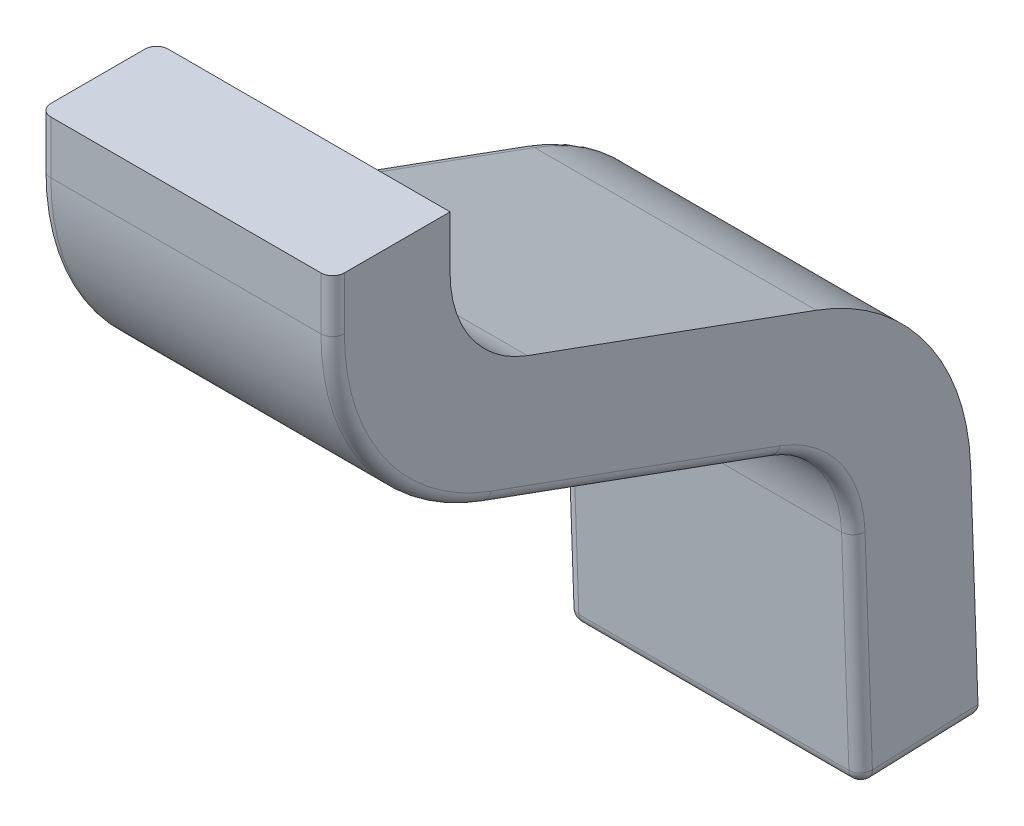
ISO-10303-21;
HEADER;
FILE_DESCRIPTION(('STEP AP214'),'2;1');
FILE_NAME('part.step','',(''),(''),'','','');
FILE_SCHEMA(('AUTOMOTIVE_DESIGN { 1 0 10303 214 1 1 1 1 }'));
ENDSEC;
DATA;
#1=APPLICATION_CONTEXT('core data for automotive mechanical design processes');
#2=APPLICATION_PROTOCOL_DEFINITION('international standard','automotive_design',2000,#1);
#3=PRODUCT_CONTEXT('',#1,'mechanical');
#4=PRODUCT('Part','Part','',(#3));
#5=PRODUCT_RELATED_PRODUCT_CATEGORY('part','',(#4));
#6=PRODUCT_DEFINITION_FORMATION('','',#4);
#7=PRODUCT_DEFINITION_CONTEXT('part definition',#1,'design');
#8=PRODUCT_DEFINITION('design','',#6,#7);
#9=PRODUCT_DEFINITION_SHAPE('','',#8);
#10=(LENGTH_UNIT() NAMED_UNIT(*) SI_UNIT(.MILLI.,.METRE.));
#11=(NAMED_UNIT(*) PLANE_ANGLE_UNIT() SI_UNIT($,.RADIAN.));
#12=(NAMED_UNIT(*) SI_UNIT($,.STERADIAN.) SOLID_ANGLE_UNIT());
#13=UNCERTAINTY_MEASURE_WITH_UNIT(LENGTH_MEASURE(1.E-05),#10,'distance_accuracy_value','');
#14=(GEOMETRIC_REPRESENTATION_CONTEXT(3) GLOBAL_UNCERTAINTY_ASSIGNED_CONTEXT((#13)) GLOBAL_UNIT_ASSIGNED_CONTEXT((#10,
#11,#12)) REPRESENTATION_CONTEXT('',''));
#15=CARTESIAN_POINT('',(0.,0.,0.));
#16=DIRECTION('',(0.,0.,1.));
#17=DIRECTION('',(1.,0.,0.));
#18=AXIS2_PLACEMENT_3D('',#15,#16,#17);
#19=CARTESIAN_POINT('',(-0.23,-1.182804143196,-0.819350743904));
#20=DIRECTION('',(1.,0.,0.));
#21=DIRECTION('',(0.,0.,-1.));
#22=AXIS2_PLACEMENT_3D('',#19,#20,#21);
#23=SPHERICAL_SURFACE('',#22,0.02);
#24=CARTESIAN_POINT('',(-0.23,-1.18280414319596,-0.819350743903962));
#25=DIRECTION('',(0.,0.0348994967024934,-0.999390827019096));
#26=DIRECTION('',(0.,0.999390827019096,0.0348994967024934));
#27=AXIS2_PLACEMENT_3D('',#24,#25,#26);
#28=CIRCLE('',#27,0.02);
#29=CARTESIAN_POINT('',(-0.23,-1.20279805146613,-0.819699738871005));
#30=VERTEX_POINT('',#29);
#31=CARTESIAN_POINT('',(-0.25,-1.182804143196,-0.819350743904126));
#32=VERTEX_POINT('',#31);
#33=EDGE_CURVE('E717',#30,#32,#28,.T.);
#34=ORIENTED_EDGE('',*,*,#33,.F.);
#35=CARTESIAN_POINT('',(-0.23,-1.182804143196,-0.819350743904));
#36=DIRECTION('',(-1.,0.,0.));
#37=DIRECTION('',(0.,0.,1.));
#38=AXIS2_PLACEMENT_3D('',#35,#36,#37);
#39=CIRCLE('',#38,0.02);
#40=CARTESIAN_POINT('',(-0.23,-1.18350213313,-0.799362927364213));
#41=VERTEX_POINT('',#40);
#42=EDGE_CURVE('E802',#41,#30,#39,.F.);
#43=ORIENTED_EDGE('',*,*,#42,.F.);
#44=CARTESIAN_POINT('',(-0.23,-1.18280414319598,-0.819350743904539));
#45=DIRECTION('',(0.,-0.999390827019096,-0.0348994967024934));
#46=DIRECTION('',(0.,0.0348994967024934,-0.999390827019096));
#47=AXIS2_PLACEMENT_3D('',#44,#45,#46);
#48=CIRCLE('',#47,0.02);
#49=EDGE_CURVE('E720',#32,#41,#48,.F.);
#50=ORIENTED_EDGE('',*,*,#49,.F.);
#51=EDGE_LOOP('',(#34,#43,#50));
#52=FACE_BOUND('',#51,.T.);
#53=ADVANCED_FACE('F17',(#52),#23,.T.);
#54=CARTESIAN_POINT('',(-0.25,-1.182804143196,-0.819350743904));
#55=DIRECTION('',(-1.,0.,0.));
#56=DIRECTION('',(0.,0.,1.));
#57=AXIS2_PLACEMENT_3D('',#54,#55,#56);
#58=CYLINDRICAL_SURFACE('',#57,0.02);
#59=DIRECTION('',(1.,0.,0.));
#60=VECTOR('',#59,1.);
#61=CARTESIAN_POINT('',(-0.25,-1.18350213312998,-0.799362927364538));
#62=LINE('',#61,#60);
#63=CARTESIAN_POINT('',(0.23,-1.18350213313014,-0.799362927364121));
#64=VERTEX_POINT('',#63);
#65=EDGE_CURVE('E640',#64,#41,#62,.F.);
#66=ORIENTED_EDGE('',*,*,#65,.T.);
#67=ORIENTED_EDGE('',*,*,#42,.T.);
#68=DIRECTION('',(1.,0.,0.));
#69=VECTOR('',#68,1.);
#70=CARTESIAN_POINT('',(0.,-1.20279195973622,-0.820048733838007));
#71=LINE('',#70,#69);
#72=CARTESIAN_POINT('',(0.23,-1.20279805146615,-0.819699738871017));
#73=VERTEX_POINT('',#72);
#74=EDGE_CURVE('E585',#73,#30,#71,.F.);
#75=ORIENTED_EDGE('',*,*,#74,.F.);
#76=CARTESIAN_POINT('',(0.23,-1.182804143196,-0.819350743904));
#77=DIRECTION('',(1.,0.,0.));
#78=DIRECTION('',(0.,0.,-1.));
#79=AXIS2_PLACEMENT_3D('',#76,#77,#78);
#80=CIRCLE('',#79,0.0200000000000001);
#81=EDGE_CURVE('E641',#64,#73,#80,.T.);
#82=ORIENTED_EDGE('',*,*,#81,.F.);
#83=EDGE_LOOP('',(#66,#67,#75,#82));
#84=FACE_BOUND('',#83,.T.);
#85=ADVANCED_FACE('F665',(#84),#58,.T.);
#86=CARTESIAN_POINT('',(-0.23,-0.825225179952,-0.806863811354));
#87=DIRECTION('',(0.,-0.999390827019096,-0.0348994967024934));
#88=DIRECTION('',(0.,0.0348994967024934,-0.999390827019096));
#89=AXIS2_PLACEMENT_3D('',#86,#87,#88);
#90=CYLINDRICAL_SURFACE('',#89,0.02);
#91=ORIENTED_EDGE('',*,*,#49,.T.);
#92=DIRECTION('',(0.,0.999390827019096,0.0348994967024934));
#93=VECTOR('',#92,1.);
#94=CARTESIAN_POINT('',(-0.23,-0.825923169886,-0.786875994814));
#95=LINE('',#94,#93);
#96=CARTESIAN_POINT('',(-0.23,-0.825923169886025,-0.786875994813852));
#97=VERTEX_POINT('',#96);
#98=EDGE_CURVE('E637',#41,#97,#95,.T.);
#99=ORIENTED_EDGE('',*,*,#98,.T.);
#100=CARTESIAN_POINT('',(-0.23,-0.825225179951994,-0.806863811354185));
#101=DIRECTION('',(0.,0.999390827019023,0.0348994967045747));
#102=DIRECTION('',(0.,0.0348994967045747,-0.999390827019023));
#103=AXIS2_PLACEMENT_3D('',#100,#101,#102);
#104=CIRCLE('',#103,0.02);
#105=CARTESIAN_POINT('',(-0.25,-0.825225179951998,-0.806863811354048));
#106=VERTEX_POINT('',#105);
#107=EDGE_CURVE('E548',#106,#97,#104,.T.);
#108=ORIENTED_EDGE('',*,*,#107,.F.);
#109=DIRECTION('',(0.,-0.999390827019149,-0.0348994967009882));
#110=VECTOR('',#109,1.);
#111=CARTESIAN_POINT('',(-0.25,-0.825225179952,-0.806863811354));
#112=LINE('',#111,#110);
#113=EDGE_CURVE('E545',#106,#32,#112,.T.);
#114=ORIENTED_EDGE('',*,*,#113,.T.);
#115=EDGE_LOOP('',(#91,#99,#108,#114));
#116=FACE_BOUND('',#115,.T.);
#117=ADVANCED_FACE('F662',(#116),#90,.T.);
#118=CARTESIAN_POINT('',(-0.23,-1.18350213313,-0.799362927364));
#119=DIRECTION('',(0.,0.0348994967024934,-0.999390827019096));
#120=DIRECTION('',(0.,0.999390827019096,0.0348994967024934));
#121=AXIS2_PLACEMENT_3D('',#118,#119,#120);
#122=CYLINDRICAL_SURFACE('',#121,0.02);
#123=ORIENTED_EDGE('',*,*,#33,.T.);
#124=DIRECTION('',(0.,0.0348994967062568,-0.999390827018965));
#125=VECTOR('',#124,1.);
#126=CARTESIAN_POINT('',(-0.25,-1.182804143196,-0.819350743904));
#127=LINE('',#126,#125);
#128=CARTESIAN_POINT('',(-0.25,-1.17722022372304,-0.979253276227001));
#129=VERTEX_POINT('',#128);
#130=EDGE_CURVE('E542',#32,#129,#127,.T.);
#131=ORIENTED_EDGE('',*,*,#130,.T.);
#132=CARTESIAN_POINT('',(-0.23,-1.177220223723,-0.979253276227));
#133=DIRECTION('',(0.,0.0348994967488581,-0.999390827017477));
#134=DIRECTION('',(1.,0.,0.));
#135=AXIS2_PLACEMENT_3D('',#132,#133,#134);
#136=CIRCLE('',#135,0.02);
#137=CARTESIAN_POINT('',(-0.23,-1.19720804026346,-0.979951266161981));
#138=VERTEX_POINT('',#137);
#139=EDGE_CURVE('E576',#138,#129,#136,.T.);
#140=ORIENTED_EDGE('',*,*,#139,.F.);
#141=DIRECTION('',(0.,0.0348994967024934,-0.999390827019096));
#142=VECTOR('',#141,1.);
#143=CARTESIAN_POINT('',(-0.23,-1.2,-0.9));
#144=LINE('',#143,#142);
#145=EDGE_CURVE('E190',#30,#138,#144,.T.);
#146=ORIENTED_EDGE('',*,*,#145,.F.);
#147=EDGE_LOOP('',(#123,#131,#140,#146));
#148=FACE_BOUND('',#147,.T.);
#149=ADVANCED_FACE('F657',(#148),#122,.T.);
#150=CARTESIAN_POINT('',(0.23,-1.182804143196,-0.819350743904));
#151=DIRECTION('',(1.,0.,0.));
#152=DIRECTION('',(0.,0.,-1.));
#153=AXIS2_PLACEMENT_3D('',#150,#151,#152);
#154=SPHERICAL_SURFACE('',#153,0.02);
#155=CARTESIAN_POINT('',(0.23,-1.18280414319596,-0.819350743903999));
#156=DIRECTION('',(0.,-0.0348994967024934,0.999390827019096));
#157=DIRECTION('',(0.,-0.999390827019096,-0.0348994967024934));
#158=AXIS2_PLACEMENT_3D('',#155,#156,#157);
#159=CIRCLE('',#158,0.02);
#160=CARTESIAN_POINT('',(0.25,-1.18280414319586,-0.819350743903995));
#161=VERTEX_POINT('',#160);
#162=EDGE_CURVE('E537',#161,#73,#159,.F.);
#163=ORIENTED_EDGE('',*,*,#162,.F.);
#164=CARTESIAN_POINT('',(0.23,-1.18280414319594,-0.819350743904537));
#165=DIRECTION('',(0.,-0.999390827019096,-0.0348994967024934));
#166=DIRECTION('',(0.,0.0348994967024934,-0.999390827019096));
#167=AXIS2_PLACEMENT_3D('',#164,#165,#166);
#168=CIRCLE('',#167,0.02);
#169=EDGE_CURVE('E529',#64,#161,#168,.F.);
#170=ORIENTED_EDGE('',*,*,#169,.F.);
#171=ORIENTED_EDGE('',*,*,#81,.T.);
#172=EDGE_LOOP('',(#163,#170,#171));
#173=FACE_BOUND('',#172,.T.);
#174=ADVANCED_FACE('F652',(#173),#154,.T.);
#175=CARTESIAN_POINT('',(-0.25,-0.825923169886,-0.786875994814));
#176=DIRECTION('',(0.,0.0348994967024934,-0.999390827019096));
#177=DIRECTION('',(0.,0.999390827019096,0.0348994967024934));
#178=AXIS2_PLACEMENT_3D('',#175,#176,#177);
#179=PLANE('',#178);
#180=DIRECTION('',(0.,-0.999390827019096,-0.0348994967024934));
#181=VECTOR('',#180,1.);
#182=CARTESIAN_POINT('',(0.23,-0.82592316988605,-0.786875994813618));
#183=LINE('',#182,#181);
#184=CARTESIAN_POINT('',(0.23,-0.825923169886018,-0.786875994813756));
#185=VERTEX_POINT('',#184);
#186=EDGE_CURVE('E526',#185,#64,#183,.T.);
#187=ORIENTED_EDGE('',*,*,#186,.F.);
#188=DIRECTION('',(-1.,0.,0.));
#189=VECTOR('',#188,1.);
#190=CARTESIAN_POINT('',(0.,-0.825923169886007,-0.786875994813802));
#191=LINE('',#190,#189);
#192=EDGE_CURVE('E506',#185,#97,#191,.T.);
#193=ORIENTED_EDGE('',*,*,#192,.T.);
#194=ORIENTED_EDGE('',*,*,#98,.F.);
#195=ORIENTED_EDGE('',*,*,#65,.F.);
#196=EDGE_LOOP('',(#187,#193,#194,#195));
#197=FACE_BOUND('',#196,.T.);
#198=ADVANCED_FACE('F656',(#197),#179,.F.);
#199=CARTESIAN_POINT('',(0.,-0.08993773853709,-0.3));
#200=DIRECTION('',(1.,0.,0.));
#201=DIRECTION('',(0.,0.,-1.));
#202=AXIS2_PLACEMENT_3D('',#199,#200,#201);
#203=CYLINDRICAL_SURFACE('',#202,0.4);
#204=DIRECTION('',(1.,0.,0.));
#205=VECTOR('',#204,1.);
#206=CARTESIAN_POINT('',(-0.25,-0.08993773853709,0.1));
#207=LINE('',#206,#205);
#208=CARTESIAN_POINT('',(-0.23,-0.08993773853709,0.1));
#209=VERTEX_POINT('',#208);
#210=CARTESIAN_POINT('',(0.23,-0.08993773853709,0.1));
#211=VERTEX_POINT('',#210);
#212=EDGE_CURVE('E627',#209,#211,#207,.T.);
#213=ORIENTED_EDGE('',*,*,#212,.F.);
#214=CARTESIAN_POINT('',(-0.23,-0.08993773853709,-0.3));
#215=DIRECTION('',(1.,0.,0.));
#216=DIRECTION('',(0.,0.,-1.));
#217=AXIS2_PLACEMENT_3D('',#214,#215,#216);
#218=CIRCLE('',#217,0.4);
#219=CARTESIAN_POINT('',(-0.23,-0.465814786851521,-0.16319194266981));
#220=VERTEX_POINT('',#219);
#221=EDGE_CURVE('E191',#220,#209,#218,.F.);
#222=ORIENTED_EDGE('',*,*,#221,.F.);
#223=DIRECTION('',(1.,0.,0.));
#224=VECTOR('',#223,1.);
#225=CARTESIAN_POINT('',(-0.25,-0.465814786851,-0.16319194267));
#226=LINE('',#225,#224);
#227=CARTESIAN_POINT('',(0.23,-0.465814786851459,-0.163191942669639));
#228=VERTEX_POINT('',#227);
#229=EDGE_CURVE('E503',#220,#228,#226,.T.);
#230=ORIENTED_EDGE('',*,*,#229,.T.);
#231=CARTESIAN_POINT('',(0.23,-0.08993773853709,-0.3));
#232=DIRECTION('',(-1.,0.,0.));
#233=DIRECTION('',(0.,0.,1.));
#234=AXIS2_PLACEMENT_3D('',#231,#232,#233);
#235=CIRCLE('',#234,0.4);
#236=EDGE_CURVE('E202',#211,#228,#235,.F.);
#237=ORIENTED_EDGE('',*,*,#236,.F.);
#238=EDGE_LOOP('',(#213,#222,#230,#237));
#239=FACE_BOUND('',#238,.T.);
#240=ADVANCED_FACE('F730',(#239),#203,.T.);
#241=CARTESIAN_POINT('',(-0.23,-0.08993773853709,0.08));
#242=DIRECTION('',(0.,1.,0.));
#243=DIRECTION('',(0.,0.,1.));
#244=AXIS2_PLACEMENT_3D('',#241,#242,#243);
#245=CYLINDRICAL_SURFACE('',#244,0.02);
#246=CARTESIAN_POINT('',(-0.23,-0.08993773853709,0.0800000000000001));
#247=DIRECTION('',(0.,-1.,0.));
#248=DIRECTION('',(0.,0.,1.));
#249=AXIS2_PLACEMENT_3D('',#246,#247,#248);
#250=CIRCLE('',#249,0.02);
#251=CARTESIAN_POINT('',(-0.25,-0.08993773853709,0.08));
#252=VERTEX_POINT('',#251);
#253=EDGE_CURVE('E608',#209,#252,#250,.T.);
#254=ORIENTED_EDGE('',*,*,#253,.F.);
#255=DIRECTION('',(0.,-1.,0.));
#256=VECTOR('',#255,1.);
#257=CARTESIAN_POINT('',(-0.23,-0.08993773853709,0.1));
#258=LINE('',#257,#256);
#259=CARTESIAN_POINT('',(-0.23,0.,0.1));
#260=VERTEX_POINT('',#259);
#261=EDGE_CURVE('E200',#260,#209,#258,.T.);
#262=ORIENTED_EDGE('',*,*,#261,.F.);
#263=CARTESIAN_POINT('',(-0.23,0.,0.08));
#264=DIRECTION('',(0.,1.,0.));
#265=DIRECTION('',(0.,0.,1.));
#266=AXIS2_PLACEMENT_3D('',#263,#264,#265);
#267=CIRCLE('',#266,0.02);
#268=CARTESIAN_POINT('',(-0.25,0.,0.08));
#269=VERTEX_POINT('',#268);
#270=EDGE_CURVE('E173',#260,#269,#267,.F.);
#271=ORIENTED_EDGE('',*,*,#270,.T.);
#272=DIRECTION('',(0.,1.,0.));
#273=VECTOR('',#272,1.);
#274=CARTESIAN_POINT('',(-0.25,-0.08993773853709,0.08));
#275=LINE('',#274,#273);
#276=EDGE_CURVE('E179',#252,#269,#275,.T.);
#277=ORIENTED_EDGE('',*,*,#276,.F.);
#278=EDGE_LOOP('',(#254,#262,#271,#277));
#279=FACE_BOUND('',#278,.T.);
#280=ADVANCED_FACE('F199',(#279),#245,.T.);
#281=CARTESIAN_POINT('',(-0.25,-0.08993773853709,0.1));
#282=DIRECTION('',(0.,0.,1.));
#283=DIRECTION('',(0.,-1.,0.));
#284=AXIS2_PLACEMENT_3D('',#281,#282,#283);
#285=PLANE('',#284);
#286=DIRECTION('',(1.,0.,0.));
#287=VECTOR('',#286,1.);
#288=CARTESIAN_POINT('',(0.,0.,0.1));
#289=LINE('',#288,#287);
#290=CARTESIAN_POINT('',(0.23,0.,0.1));
#291=VERTEX_POINT('',#290);
#292=EDGE_CURVE('E465',#291,#260,#289,.F.);
#293=ORIENTED_EDGE('',*,*,#292,.T.);
#294=ORIENTED_EDGE('',*,*,#261,.T.);
#295=ORIENTED_EDGE('',*,*,#212,.T.);
#296=DIRECTION('',(0.,1.,0.));
#297=VECTOR('',#296,1.);
#298=CARTESIAN_POINT('',(0.23,-0.08993773853709,0.1));
#299=LINE('',#298,#297);
#300=EDGE_CURVE('E615',#291,#211,#299,.F.);
#301=ORIENTED_EDGE('',*,*,#300,.F.);
#302=EDGE_LOOP('',(#293,#294,#295,#301));
#303=FACE_BOUND('',#302,.T.);
#304=ADVANCED_FACE('F813',(#303),#285,.T.);
#305=CARTESIAN_POINT('',(0.23,-0.08993773853709,0.08));
#306=DIRECTION('',(0.,1.,0.));
#307=DIRECTION('',(0.,0.,1.));
#308=AXIS2_PLACEMENT_3D('',#305,#306,#307);
#309=CYLINDRICAL_SURFACE('',#308,0.02);
#310=CARTESIAN_POINT('',(0.23,0.,0.08));
#311=DIRECTION('',(0.,1.,0.));
#312=DIRECTION('',(0.,0.,1.));
#313=AXIS2_PLACEMENT_3D('',#310,#311,#312);
#314=CIRCLE('',#313,0.02);
#315=CARTESIAN_POINT('',(0.25,0.,0.08));
#316=VERTEX_POINT('',#315);
#317=EDGE_CURVE('E197',#316,#291,#314,.F.);
#318=ORIENTED_EDGE('',*,*,#317,.T.);
#319=ORIENTED_EDGE('',*,*,#300,.T.);
#320=CARTESIAN_POINT('',(0.23,-0.08993773853709,0.08));
#321=DIRECTION('',(0.,1.,0.));
#322=DIRECTION('',(0.,0.,1.));
#323=AXIS2_PLACEMENT_3D('',#320,#321,#322);
#324=CIRCLE('',#323,0.02);
#325=CARTESIAN_POINT('',(0.25,-0.08993773853709,0.0800000000000666));
#326=VERTEX_POINT('',#325);
#327=EDGE_CURVE('E204',#326,#211,#324,.F.);
#328=ORIENTED_EDGE('',*,*,#327,.F.);
#329=DIRECTION('',(0.,1.,0.));
#330=VECTOR('',#329,1.);
#331=CARTESIAN_POINT('',(0.25,-0.08993773853709,0.08));
#332=LINE('',#331,#330);
#333=EDGE_CURVE('E464',#316,#326,#332,.F.);
#334=ORIENTED_EDGE('',*,*,#333,.F.);
#335=EDGE_LOOP('',(#318,#319,#328,#334));
#336=FACE_BOUND('',#335,.T.);
#337=ADVANCED_FACE('F602',(#336),#309,.T.);
#338=CARTESIAN_POINT('',(-0.23,-0.08993773853709,-0.3));
#339=DIRECTION('',(1.,0.,0.));
#340=DIRECTION('',(0.,0.,-1.));
#341=AXIS2_PLACEMENT_3D('',#338,#339,#340);
#342=TOROIDAL_SURFACE('',#341,0.38,0.02);
#343=CARTESIAN_POINT('',(-0.23,-0.447020934436083,-0.170032345536228));
#344=DIRECTION('',(0.,-0.342020143325932,-0.939692620785813));
#345=DIRECTION('',(0.,0.939692620785813,-0.342020143325932));
#346=AXIS2_PLACEMENT_3D('',#343,#344,#345);
#347=CIRCLE('',#346,0.02);
#348=CARTESIAN_POINT('',(-0.25,-0.447020934435954,-0.170032345536068));
#349=VERTEX_POINT('',#348);
#350=EDGE_CURVE('E423',#220,#349,#347,.T.);
#351=ORIENTED_EDGE('',*,*,#350,.F.);
#352=ORIENTED_EDGE('',*,*,#221,.T.);
#353=ORIENTED_EDGE('',*,*,#253,.T.);
#354=CARTESIAN_POINT('',(-0.25,-0.08993773853709,-0.3));
#355=DIRECTION('',(1.,0.,0.));
#356=DIRECTION('',(0.,0.,1.));
#357=AXIS2_PLACEMENT_3D('',#354,#355,#356);
#358=CIRCLE('',#357,0.38);
#359=EDGE_CURVE('E186',#252,#349,#358,.T.);
#360=ORIENTED_EDGE('',*,*,#359,.T.);
#361=EDGE_LOOP('',(#351,#352,#353,#360));
#362=FACE_BOUND('',#361,.T.);
#363=ADVANCED_FACE('F597',(#362),#342,.T.);
#364=CARTESIAN_POINT('',(0.,-1.2,-0.9));
#365=DIRECTION('',(0.,-0.999390827019096,-0.0348994967024934));
#366=DIRECTION('',(0.,0.0348994967024934,-0.999390827019096));
#367=AXIS2_PLACEMENT_3D('',#364,#365,#366);
#368=PLANE('',#367);
#369=DIRECTION('',(0.,-0.0348994967024934,0.999390827019096));
#370=VECTOR('',#369,1.);
#371=CARTESIAN_POINT('',(0.23,-1.20348994967038,-0.80006091729805));
#372=LINE('',#371,#370);
#373=CARTESIAN_POINT('',(0.230000000000464,-1.19720804026365,-0.979951266161523));
#374=VERTEX_POINT('',#373);
#375=EDGE_CURVE('E533',#73,#374,#372,.F.);
#376=ORIENTED_EDGE('',*,*,#375,.F.);
#377=ORIENTED_EDGE('',*,*,#74,.T.);
#378=ORIENTED_EDGE('',*,*,#145,.T.);
#379=DIRECTION('',(1.,0.,0.));
#380=VECTOR('',#379,1.);
#381=CARTESIAN_POINT('',(-0.25,-1.19720804026335,-0.979951266161977));
#382=LINE('',#381,#380);
#383=EDGE_CURVE('E396',#374,#138,#382,.F.);
#384=ORIENTED_EDGE('',*,*,#383,.F.);
#385=EDGE_LOOP('',(#376,#377,#378,#384));
#386=FACE_BOUND('',#385,.T.);
#387=ADVANCED_FACE('F601',(#386),#368,.T.);
#388=CARTESIAN_POINT('',(-0.23,-1.177220223723,-0.979253276227));
#389=DIRECTION('',(1.,0.,0.));
#390=DIRECTION('',(0.,0.,-1.));
#391=AXIS2_PLACEMENT_3D('',#388,#389,#390);
#392=SPHERICAL_SURFACE('',#391,0.02);
#393=ORIENTED_EDGE('',*,*,#139,.T.);
#394=CARTESIAN_POINT('',(-0.23,-1.17722022372305,-0.979253276227506));
#395=DIRECTION('',(0.,-0.999390827019096,-0.0348994967024934));
#396=DIRECTION('',(0.,0.0348994967024934,-0.999390827019096));
#397=AXIS2_PLACEMENT_3D('',#394,#395,#396);
#398=CIRCLE('',#397,0.02);
#399=CARTESIAN_POINT('',(-0.23,-1.176522233789,-0.999241092767444));
#400=VERTEX_POINT('',#399);
#401=EDGE_CURVE('E393',#400,#129,#398,.F.);
#402=ORIENTED_EDGE('',*,*,#401,.F.);
#403=CARTESIAN_POINT('',(-0.23,-1.177220223723,-0.979253276227));
#404=DIRECTION('',(1.,0.,0.));
#405=DIRECTION('',(0.,0.,-1.));
#406=AXIS2_PLACEMENT_3D('',#403,#404,#405);
#407=CIRCLE('',#406,0.02);
#408=EDGE_CURVE('E402',#138,#400,#407,.T.);
#409=ORIENTED_EDGE('',*,*,#408,.F.);
#410=EDGE_LOOP('',(#393,#402,#409));
#411=FACE_BOUND('',#410,.T.);
#412=ADVANCED_FACE('F562',(#411),#392,.T.);
#413=CARTESIAN_POINT('',(-0.23,-0.832903069227,-0.58699782941));
#414=DIRECTION('',(1.,0.,0.));
#415=DIRECTION('',(0.,0.,-1.));
#416=AXIS2_PLACEMENT_3D('',#413,#414,#415);
#417=TOROIDAL_SURFACE('',#416,0.22,0.02);
#418=ORIENTED_EDGE('',*,*,#107,.T.);
#419=CARTESIAN_POINT('',(-0.23,-0.832903069227,-0.58699782941));
#420=DIRECTION('',(-1.,0.,0.));
#421=DIRECTION('',(0.,0.,1.));
#422=AXIS2_PLACEMENT_3D('',#419,#420,#421);
#423=CIRCLE('',#422,0.2);
#424=CARTESIAN_POINT('',(-0.23,-0.644964545069785,-0.655401858074845));
#425=VERTEX_POINT('',#424);
#426=EDGE_CURVE('E523',#97,#425,#423,.F.);
#427=ORIENTED_EDGE('',*,*,#426,.T.);
#428=CARTESIAN_POINT('',(-0.23,-0.626170692654231,-0.662242260940916));
#429=DIRECTION('',(0.,-0.342020143325932,-0.939692620785813));
#430=DIRECTION('',(0.,0.939692620785813,-0.342020143325932));
#431=AXIS2_PLACEMENT_3D('',#428,#429,#430);
#432=CIRCLE('',#431,0.02);
#433=CARTESIAN_POINT('',(-0.25,-0.626170692654073,-0.662242260941095));
#434=VERTEX_POINT('',#433);
#435=EDGE_CURVE('E425',#434,#425,#432,.F.);
#436=ORIENTED_EDGE('',*,*,#435,.F.);
#437=CARTESIAN_POINT('',(-0.25,-0.832903069227,-0.58699782941));
#438=DIRECTION('',(-1.,0.,0.));
#439=DIRECTION('',(0.,0.939692620786017,-0.34202014332537));
#440=AXIS2_PLACEMENT_3D('',#437,#438,#439);
#441=CIRCLE('',#440,0.219999999999936);
#442=EDGE_CURVE('E392',#434,#106,#441,.T.);
#443=ORIENTED_EDGE('',*,*,#442,.T.);
#444=EDGE_LOOP('',(#418,#427,#436,#443));
#445=FACE_BOUND('',#444,.T.);
#446=ADVANCED_FACE('F556',(#445),#417,.T.);
#447=CARTESIAN_POINT('',(0.23,-1.18350213313,-0.799362927364));
#448=DIRECTION('',(0.,-0.0348994967024934,0.999390827019096));
#449=DIRECTION('',(0.,-0.999390827019096,-0.0348994967024934));
#450=AXIS2_PLACEMENT_3D('',#447,#448,#449);
#451=CYLINDRICAL_SURFACE('',#450,0.02);
#452=ORIENTED_EDGE('',*,*,#162,.T.);
#453=ORIENTED_EDGE('',*,*,#375,.T.);
#454=CARTESIAN_POINT('',(0.23,-1.17722022372328,-0.97925327622701));
#455=DIRECTION('',(0.707106781186547,-0.0246776707783306,0.706676030840835));
#456=DIRECTION('',(0.707106781186547,0.0246776707783306,-0.706676030840835));
#457=AXIS2_PLACEMENT_3D('',#454,#455,#456);
#458=ELLIPSE('',#457,0.0282842712474619,0.02);
#459=CARTESIAN_POINT('',(0.249999238243851,-1.17652223378895,-0.999241092767442));
#460=VERTEX_POINT('',#459);
#461=EDGE_CURVE('E399',#460,#374,#458,.F.);
#462=ORIENTED_EDGE('',*,*,#461,.F.);
#463=DIRECTION('',(0.,-0.0348994967054423,0.999390827018993));
#464=VECTOR('',#463,1.);
#465=CARTESIAN_POINT('',(0.25,-1.176522233789,-0.999241092768));
#466=LINE('',#465,#464);
#467=EDGE_CURVE('E372',#460,#161,#466,.T.);
#468=ORIENTED_EDGE('',*,*,#467,.T.);
#469=EDGE_LOOP('',(#452,#453,#462,#468));
#470=FACE_BOUND('',#469,.T.);
#471=ADVANCED_FACE('F561',(#470),#451,.T.);
#472=CARTESIAN_POINT('',(0.23,-0.825225179952,-0.806863811354));
#473=DIRECTION('',(0.,-0.999390827019096,-0.0348994967024934));
#474=DIRECTION('',(0.,0.0348994967024934,-0.999390827019096));
#475=AXIS2_PLACEMENT_3D('',#472,#473,#474);
#476=CYLINDRICAL_SURFACE('',#475,0.02);
#477=CARTESIAN_POINT('',(0.23,-0.825225179951908,-0.806863811354182));
#478=DIRECTION('',(0.,-0.99939082701901,-0.0348994967049652));
#479=DIRECTION('',(0.,0.0348994967049652,-0.99939082701901));
#480=AXIS2_PLACEMENT_3D('',#477,#478,#479);
#481=CIRCLE('',#480,0.02);
#482=CARTESIAN_POINT('',(0.25,-0.825225179951964,-0.806863811354036));
#483=VERTEX_POINT('',#482);
#484=EDGE_CURVE('E360',#185,#483,#481,.F.);
#485=ORIENTED_EDGE('',*,*,#484,.F.);
#486=ORIENTED_EDGE('',*,*,#186,.T.);
#487=ORIENTED_EDGE('',*,*,#169,.T.);
#488=DIRECTION('',(0.,0.999390827019149,0.0348994967009882));
#489=VECTOR('',#488,1.);
#490=CARTESIAN_POINT('',(0.25,-1.182804143196,-0.819350743904));
#491=LINE('',#490,#489);
#492=EDGE_CURVE('E367',#161,#483,#491,.T.);
#493=ORIENTED_EDGE('',*,*,#492,.T.);
#494=EDGE_LOOP('',(#485,#486,#487,#493));
#495=FACE_BOUND('',#494,.T.);
#496=ADVANCED_FACE('F774',(#495),#476,.T.);
#497=CARTESIAN_POINT('',(0.,-0.832903069227,-0.58699782941));
#498=DIRECTION('',(-1.,0.,0.));
#499=DIRECTION('',(0.,0.,1.));
#500=AXIS2_PLACEMENT_3D('',#497,#498,#499);
#501=CYLINDRICAL_SURFACE('',#500,0.2);
#502=CARTESIAN_POINT('',(0.23,-0.832903069227,-0.58699782941));
#503=DIRECTION('',(-1.,0.,0.));
#504=DIRECTION('',(0.,0.,1.));
#505=AXIS2_PLACEMENT_3D('',#502,#503,#504);
#506=CIRCLE('',#505,0.2);
#507=CARTESIAN_POINT('',(0.23,-0.64496454506986,-0.655401858075051));
#508=VERTEX_POINT('',#507);
#509=EDGE_CURVE('E341',#508,#185,#506,.T.);
#510=ORIENTED_EDGE('',*,*,#509,.F.);
#511=DIRECTION('',(1.,0.,0.));
#512=VECTOR('',#511,1.);
#513=CARTESIAN_POINT('',(-0.25,-0.644964545069348,-0.655401858075237));
#514=LINE('',#513,#512);
#515=EDGE_CURVE('E498',#508,#425,#514,.F.);
#516=ORIENTED_EDGE('',*,*,#515,.T.);
#517=ORIENTED_EDGE('',*,*,#426,.F.);
#518=ORIENTED_EDGE('',*,*,#192,.F.);
#519=EDGE_LOOP('',(#510,#516,#517,#518));
#520=FACE_BOUND('',#519,.T.);
#521=ADVANCED_FACE('F770',(#520),#501,.F.);
#522=CARTESIAN_POINT('',(-0.25,-0.465814786851,-0.16319194267));
#523=DIRECTION('',(0.,0.939692620785813,-0.342020143325932));
#524=DIRECTION('',(0.,0.342020143325932,0.939692620785813));
#525=AXIS2_PLACEMENT_3D('',#522,#523,#524);
#526=PLANE('',#525);
#527=DIRECTION('',(0.,-0.342020143325932,-0.939692620785813));
#528=VECTOR('',#527,1.);
#529=CARTESIAN_POINT('',(0.23,-0.465814786851716,-0.163191942669481));
#530=LINE('',#529,#528);
#531=EDGE_CURVE('E336',#228,#508,#530,.T.);
#532=ORIENTED_EDGE('',*,*,#531,.F.);
#533=ORIENTED_EDGE('',*,*,#229,.F.);
#534=DIRECTION('',(0.,-0.342020143325932,-0.939692620785813));
#535=VECTOR('',#534,1.);
#536=CARTESIAN_POINT('',(-0.23,-0.465814786851716,-0.163191942669481));
#537=LINE('',#536,#535);
#538=EDGE_CURVE('E431',#425,#220,#537,.F.);
#539=ORIENTED_EDGE('',*,*,#538,.F.);
#540=ORIENTED_EDGE('',*,*,#515,.F.);
#541=EDGE_LOOP('',(#532,#533,#539,#540));
#542=FACE_BOUND('',#541,.T.);
#543=ADVANCED_FACE('F484',(#542),#526,.F.);
#544=CARTESIAN_POINT('',(0.23,-0.08993773853709,-0.3));
#545=DIRECTION('',(-1.,0.,0.));
#546=DIRECTION('',(0.,0.,1.));
#547=AXIS2_PLACEMENT_3D('',#544,#545,#546);
#548=TOROIDAL_SURFACE('',#547,0.38,0.02);
#549=ORIENTED_EDGE('',*,*,#327,.T.);
#550=ORIENTED_EDGE('',*,*,#236,.T.);
#551=CARTESIAN_POINT('',(0.23,-0.447020934436,-0.170032345536));
#552=DIRECTION('',(0.,-0.342020143325932,-0.939692620785813));
#553=DIRECTION('',(0.,0.939692620785813,-0.342020143325932));
#554=AXIS2_PLACEMENT_3D('',#551,#552,#553);
#555=CIRCLE('',#554,0.02);
#556=CARTESIAN_POINT('',(0.25,-0.447020934435938,-0.170032345536072));
#557=VERTEX_POINT('',#556);
#558=EDGE_CURVE('E333',#557,#228,#555,.T.);
#559=ORIENTED_EDGE('',*,*,#558,.F.);
#560=CARTESIAN_POINT('',(0.25,-0.08993773853709,-0.3));
#561=DIRECTION('',(-1.,0.,0.));
#562=DIRECTION('',(0.,-0.939692620785991,0.342020143325442));
#563=AXIS2_PLACEMENT_3D('',#560,#561,#562);
#564=CIRCLE('',#563,0.380000000000166);
#565=EDGE_CURVE('E213',#557,#326,#564,.T.);
#566=ORIENTED_EDGE('',*,*,#565,.T.);
#567=EDGE_LOOP('',(#549,#550,#559,#566));
#568=FACE_BOUND('',#567,.T.);
#569=ADVANCED_FACE('F479',(#568),#548,.T.);
#570=CARTESIAN_POINT('',(0.,0.,0.));
#571=DIRECTION('',(0.,-1.,0.));
#572=DIRECTION('',(0.,0.,-1.));
#573=AXIS2_PLACEMENT_3D('',#570,#571,#572);
#574=PLANE('',#573);
#575=ORIENTED_EDGE('',*,*,#317,.F.);
#576=DIRECTION('',(0.,0.,-1.));
#577=VECTOR('',#576,1.);
#578=CARTESIAN_POINT('',(0.25,0.,0.1));
#579=LINE('',#578,#577);
#580=CARTESIAN_POINT('',(0.25,0.,-0.1));
#581=VERTEX_POINT('',#580);
#582=EDGE_CURVE('E461',#581,#316,#579,.F.);
#583=ORIENTED_EDGE('',*,*,#582,.F.);
#584=DIRECTION('',(1.,0.,0.));
#585=VECTOR('',#584,1.);
#586=CARTESIAN_POINT('',(-0.25,0.,-0.1));
#587=LINE('',#586,#585);
#588=CARTESIAN_POINT('',(-0.23,0.,-0.1));
#589=VERTEX_POINT('',#588);
#590=EDGE_CURVE('E326',#589,#581,#587,.T.);
#591=ORIENTED_EDGE('',*,*,#590,.F.);
#592=CARTESIAN_POINT('',(-0.23,0.,-0.08));
#593=DIRECTION('',(0.,1.,0.));
#594=DIRECTION('',(0.,0.,1.));
#595=AXIS2_PLACEMENT_3D('',#592,#593,#594);
#596=CIRCLE('',#595,0.02);
#597=CARTESIAN_POINT('',(-0.25,0.,-0.08));
#598=VERTEX_POINT('',#597);
#599=EDGE_CURVE('E196',#598,#589,#596,.F.);
#600=ORIENTED_EDGE('',*,*,#599,.F.);
#601=DIRECTION('',(0.,0.,-1.));
#602=VECTOR('',#601,1.);
#603=CARTESIAN_POINT('',(-0.25,0.,0.));
#604=LINE('',#603,#602);
#605=EDGE_CURVE('E182',#269,#598,#604,.T.);
#606=ORIENTED_EDGE('',*,*,#605,.F.);
#607=ORIENTED_EDGE('',*,*,#270,.F.);
#608=ORIENTED_EDGE('',*,*,#292,.F.);
#609=EDGE_LOOP('',(#575,#583,#591,#600,#606,#607,#608));
#610=FACE_BOUND('',#609,.T.);
#611=ADVANCED_FACE('F194',(#610),#574,.F.);
#612=CARTESIAN_POINT('',(-0.23,-0.08993773853709,-0.08));
#613=DIRECTION('',(0.,1.,0.));
#614=DIRECTION('',(0.,0.,1.));
#615=AXIS2_PLACEMENT_3D('',#612,#613,#614);
#616=CYLINDRICAL_SURFACE('',#615,0.02);
#617=CARTESIAN_POINT('',(-0.23,-0.08993773853709,-0.08));
#618=DIRECTION('',(0.,-1.,0.));
#619=DIRECTION('',(0.,0.,1.));
#620=AXIS2_PLACEMENT_3D('',#617,#618,#619);
#621=CIRCLE('',#620,0.02);
#622=CARTESIAN_POINT('',(-0.25,-0.08993773853709,-0.0799999999999609));
#623=VERTEX_POINT('',#622);
#624=CARTESIAN_POINT('',(-0.23,-0.08993773853709,-0.1));
#625=VERTEX_POINT('',#624);
#626=EDGE_CURVE('E325',#623,#625,#621,.T.);
#627=ORIENTED_EDGE('',*,*,#626,.F.);
#628=DIRECTION('',(0.,1.,0.));
#629=VECTOR('',#628,1.);
#630=CARTESIAN_POINT('',(-0.25,-0.08993773853709,-0.08));
#631=LINE('',#630,#629);
#632=EDGE_CURVE('E426',#623,#598,#631,.T.);
#633=ORIENTED_EDGE('',*,*,#632,.T.);
#634=ORIENTED_EDGE('',*,*,#599,.T.);
#635=DIRECTION('',(0.,1.,0.));
#636=VECTOR('',#635,1.);
#637=CARTESIAN_POINT('',(-0.23,-0.08993773853709,-0.1));
#638=LINE('',#637,#636);
#639=EDGE_CURVE('E452',#625,#589,#638,.T.);
#640=ORIENTED_EDGE('',*,*,#639,.F.);
#641=EDGE_LOOP('',(#627,#633,#634,#640));
#642=FACE_BOUND('',#641,.T.);
#643=ADVANCED_FACE('F745',(#642),#616,.T.);
#644=CARTESIAN_POINT('',(-0.23,-0.447020934436,-0.170032345536));
#645=DIRECTION('',(0.,-0.342020143325932,-0.939692620785813));
#646=DIRECTION('',(0.,0.939692620785813,-0.342020143325932));
#647=AXIS2_PLACEMENT_3D('',#644,#645,#646);
#648=CYLINDRICAL_SURFACE('',#647,0.02);
#649=ORIENTED_EDGE('',*,*,#435,.T.);
#650=ORIENTED_EDGE('',*,*,#538,.T.);
#651=ORIENTED_EDGE('',*,*,#350,.T.);
#652=DIRECTION('',(0.,-0.342020143325491,-0.939692620785973));
#653=VECTOR('',#652,1.);
#654=CARTESIAN_POINT('',(-0.25,-0.447020934436,-0.170032345536));
#655=LINE('',#654,#653);
#656=EDGE_CURVE('E417',#349,#434,#655,.T.);
#657=ORIENTED_EDGE('',*,*,#656,.T.);
#658=EDGE_LOOP('',(#649,#650,#651,#657));
#659=FACE_BOUND('',#658,.T.);
#660=ADVANCED_FACE('F896',(#659),#648,.T.);
#661=CARTESIAN_POINT('',(-0.25,-1.177220223723,-0.979253276227));
#662=DIRECTION('',(1.,0.,0.));
#663=DIRECTION('',(0.,0.,-1.));
#664=AXIS2_PLACEMENT_3D('',#661,#662,#663);
#665=CYLINDRICAL_SURFACE('',#664,0.02);
#666=ORIENTED_EDGE('',*,*,#461,.T.);
#667=ORIENTED_EDGE('',*,*,#383,.T.);
#668=ORIENTED_EDGE('',*,*,#408,.T.);
#669=DIRECTION('',(1.,0.,0.));
#670=VECTOR('',#669,1.);
#671=CARTESIAN_POINT('',(-0.25,-1.17652223378895,-0.999241092767442));
#672=LINE('',#671,#670);
#673=EDGE_CURVE('E294',#400,#460,#672,.T.);
#674=ORIENTED_EDGE('',*,*,#673,.T.);
#675=EDGE_LOOP('',(#666,#667,#668,#674));
#676=FACE_BOUND('',#675,.T.);
#677=ADVANCED_FACE('F783',(#676),#665,.T.);
#678=CARTESIAN_POINT('',(-0.23,-0.81964126048,-0.966766343677));
#679=DIRECTION('',(0.,-0.999390827019096,-0.0348994967024934));
#680=DIRECTION('',(0.,0.0348994967024934,-0.999390827019096));
#681=AXIS2_PLACEMENT_3D('',#678,#679,#680);
#682=CYLINDRICAL_SURFACE('',#681,0.02);
#683=ORIENTED_EDGE('',*,*,#401,.T.);
#684=DIRECTION('',(0.,-0.999390827019096,-0.0348994967024934));
#685=VECTOR('',#684,1.);
#686=CARTESIAN_POINT('',(-0.25,-0.819641260480018,-0.966766343676496));
#687=LINE('',#686,#685);
#688=CARTESIAN_POINT('',(-0.25,-0.819641260480017,-0.966766343676951));
#689=VERTEX_POINT('',#688);
#690=EDGE_CURVE('E284',#129,#689,#687,.F.);
#691=ORIENTED_EDGE('',*,*,#690,.T.);
#692=CARTESIAN_POINT('',(-0.23,-0.819641260480029,-0.966766343677256));
#693=DIRECTION('',(0.,0.999390827019094,0.0348994967025555));
#694=DIRECTION('',(0.,0.0348994967025555,-0.999390827019094));
#695=AXIS2_PLACEMENT_3D('',#692,#693,#694);
#696=CIRCLE('',#695,0.02);
#697=CARTESIAN_POINT('',(-0.23,-0.818943270545983,-0.986754160217478));
#698=VERTEX_POINT('',#697);
#699=EDGE_CURVE('E291',#698,#689,#696,.T.);
#700=ORIENTED_EDGE('',*,*,#699,.F.);
#701=DIRECTION('',(0.,-0.999390827019096,-0.0348994967024934));
#702=VECTOR('',#701,1.);
#703=CARTESIAN_POINT('',(-0.23,-0.818943270546,-0.986754160217));
#704=LINE('',#703,#702);
#705=EDGE_CURVE('E298',#698,#400,#704,.T.);
#706=ORIENTED_EDGE('',*,*,#705,.T.);
#707=EDGE_LOOP('',(#683,#691,#700,#706));
#708=FACE_BOUND('',#707,.T.);
#709=ADVANCED_FACE('F354',(#708),#682,.T.);
#710=CARTESIAN_POINT('',(0.23,-0.832903069227,-0.58699782941));
#711=DIRECTION('',(-1.,0.,0.));
#712=DIRECTION('',(0.,0.,1.));
#713=AXIS2_PLACEMENT_3D('',#710,#711,#712);
#714=TOROIDAL_SURFACE('',#713,0.22,0.02);
#715=CARTESIAN_POINT('',(0.23,-0.626170692654431,-0.662242260941465));
#716=DIRECTION('',(0.,-0.342020143325932,-0.939692620785813));
#717=DIRECTION('',(0.,0.939692620785813,-0.342020143325932));
#718=AXIS2_PLACEMENT_3D('',#715,#716,#717);
#719=CIRCLE('',#718,0.02);
#720=CARTESIAN_POINT('',(0.25,-0.626170692654033,-0.662242260941112));
#721=VERTEX_POINT('',#720);
#722=EDGE_CURVE('E337',#508,#721,#719,.F.);
#723=ORIENTED_EDGE('',*,*,#722,.F.);
#724=ORIENTED_EDGE('',*,*,#509,.T.);
#725=ORIENTED_EDGE('',*,*,#484,.T.);
#726=CARTESIAN_POINT('',(0.25,-0.832903069227,-0.58699782941));
#727=DIRECTION('',(1.,0.,0.));
#728=DIRECTION('',(0.,0.0348994967049647,-0.99939082701901));
#729=AXIS2_PLACEMENT_3D('',#726,#727,#728);
#730=CIRCLE('',#729,0.219999999999907);
#731=EDGE_CURVE('E290',#483,#721,#730,.T.);
#732=ORIENTED_EDGE('',*,*,#731,.T.);
#733=EDGE_LOOP('',(#723,#724,#725,#732));
#734=FACE_BOUND('',#733,.T.);
#735=ADVANCED_FACE('F348',(#734),#714,.T.);
#736=CARTESIAN_POINT('',(0.23,-0.447020934436,-0.170032345536));
#737=DIRECTION('',(0.,-0.342020143325932,-0.939692620785813));
#738=DIRECTION('',(0.,0.939692620785813,-0.342020143325932));
#739=AXIS2_PLACEMENT_3D('',#736,#737,#738);
#740=CYLINDRICAL_SURFACE('',#739,0.02);
#741=ORIENTED_EDGE('',*,*,#558,.T.);
#742=ORIENTED_EDGE('',*,*,#531,.T.);
#743=ORIENTED_EDGE('',*,*,#722,.T.);
#744=DIRECTION('',(0.,0.342020143325491,0.939692620785973));
#745=VECTOR('',#744,1.);
#746=CARTESIAN_POINT('',(0.25,-0.626170692654,-0.662242260941));
#747=LINE('',#746,#745);
#748=EDGE_CURVE('E293',#721,#557,#747,.T.);
#749=ORIENTED_EDGE('',*,*,#748,.T.);
#750=EDGE_LOOP('',(#741,#742,#743,#749));
#751=FACE_BOUND('',#750,.T.);
#752=ADVANCED_FACE('F353',(#751),#740,.T.);
#753=CARTESIAN_POINT('',(-0.25,-0.08993773853709,-0.1));
#754=DIRECTION('',(0.,0.,-1.));
#755=DIRECTION('',(0.,1.,0.));
#756=AXIS2_PLACEMENT_3D('',#753,#754,#755);
#757=PLANE('',#756);
#758=ORIENTED_EDGE('',*,*,#590,.T.);
#759=DIRECTION('',(0.,1.,0.));
#760=VECTOR('',#759,1.);
#761=CARTESIAN_POINT('',(0.25,-0.08993773853709,-0.1));
#762=LINE('',#761,#760);
#763=CARTESIAN_POINT('',(0.25,-0.08993773853709,-0.1));
#764=VERTEX_POINT('',#763);
#765=EDGE_CURVE('E323',#581,#764,#762,.F.);
#766=ORIENTED_EDGE('',*,*,#765,.T.);
#767=DIRECTION('',(1.,0.,0.));
#768=VECTOR('',#767,1.);
#769=CARTESIAN_POINT('',(0.,-0.08993773853709,-0.1));
#770=LINE('',#769,#768);
#771=EDGE_CURVE('E316',#764,#625,#770,.F.);
#772=ORIENTED_EDGE('',*,*,#771,.T.);
#773=ORIENTED_EDGE('',*,*,#639,.T.);
#774=EDGE_LOOP('',(#758,#766,#772,#773));
#775=FACE_BOUND('',#774,.T.);
#776=ADVANCED_FACE('F748',(#775),#757,.T.);
#777=CARTESIAN_POINT('',(-0.23,-0.08993773853709,-0.3));
#778=DIRECTION('',(1.,0.,0.));
#779=DIRECTION('',(0.,0.,-1.));
#780=AXIS2_PLACEMENT_3D('',#777,#778,#779);
#781=TOROIDAL_SURFACE('',#780,0.22,0.02);
#782=CARTESIAN_POINT('',(-0.23,-0.29667011511,-0.224755568468));
#783=DIRECTION('',(0.,-0.342020143325932,-0.939692620785813));
#784=DIRECTION('',(0.,0.939692620785813,-0.342020143325932));
#785=AXIS2_PLACEMENT_3D('',#782,#783,#784);
#786=CIRCLE('',#785,0.02);
#787=CARTESIAN_POINT('',(-0.25,-0.296670115109943,-0.224755568468098));
#788=VERTEX_POINT('',#787);
#789=CARTESIAN_POINT('',(-0.23,-0.277876262694248,-0.231595971334863));
#790=VERTEX_POINT('',#789);
#791=EDGE_CURVE('E385',#788,#790,#786,.T.);
#792=ORIENTED_EDGE('',*,*,#791,.F.);
#793=CARTESIAN_POINT('',(-0.25,-0.08993773853709,-0.3));
#794=DIRECTION('',(-1.,0.,0.));
#795=DIRECTION('',(0.,-0.939692620785681,0.342020143326293));
#796=AXIS2_PLACEMENT_3D('',#793,#794,#795);
#797=CIRCLE('',#796,0.22000000000013);
#798=EDGE_CURVE('E248',#788,#623,#797,.T.);
#799=ORIENTED_EDGE('',*,*,#798,.T.);
#800=ORIENTED_EDGE('',*,*,#626,.T.);
#801=CARTESIAN_POINT('',(-0.23,-0.08993773853709,-0.3));
#802=DIRECTION('',(1.,0.,0.));
#803=DIRECTION('',(0.,0.,-1.));
#804=AXIS2_PLACEMENT_3D('',#801,#802,#803);
#805=CIRCLE('',#804,0.2);
#806=EDGE_CURVE('E319',#625,#790,#805,.T.);
#807=ORIENTED_EDGE('',*,*,#806,.T.);
#808=EDGE_LOOP('',(#792,#799,#800,#807));
#809=FACE_BOUND('',#808,.T.);
#810=ADVANCED_FACE('F262',(#809),#781,.T.);
#811=CARTESIAN_POINT('',(-0.25,-0.465814786851,-0.16319194267));
#812=DIRECTION('',(1.,0.,0.));
#813=DIRECTION('',(0.,0.,-1.));
#814=AXIS2_PLACEMENT_3D('',#811,#812,#813);
#815=PLANE('',#814);
#816=DIRECTION('',(0.,-0.342020143325932,-0.939692620785813));
#817=VECTOR('',#816,1.);
#818=CARTESIAN_POINT('',(-0.25,-0.296670115109769,-0.224755568468084));
#819=LINE('',#818,#817);
#820=CARTESIAN_POINT('',(-0.25,-0.475819873328113,-0.716965483873073));
#821=VERTEX_POINT('',#820);
#822=EDGE_CURVE('E285',#821,#788,#819,.F.);
#823=ORIENTED_EDGE('',*,*,#822,.F.);
#824=CARTESIAN_POINT('',(-0.25,-0.832903069227,-0.58699782941));
#825=DIRECTION('',(1.,0.,0.));
#826=DIRECTION('',(0.,0.0348994967025554,-0.999390827019094));
#827=AXIS2_PLACEMENT_3D('',#824,#825,#826);
#828=CIRCLE('',#827,0.379999999999873);
#829=EDGE_CURVE('E282',#689,#821,#828,.T.);
#830=ORIENTED_EDGE('',*,*,#829,.F.);
#831=ORIENTED_EDGE('',*,*,#690,.F.);
#832=ORIENTED_EDGE('',*,*,#130,.F.);
#833=ORIENTED_EDGE('',*,*,#113,.F.);
#834=ORIENTED_EDGE('',*,*,#442,.F.);
#835=ORIENTED_EDGE('',*,*,#656,.F.);
#836=ORIENTED_EDGE('',*,*,#359,.F.);
#837=ORIENTED_EDGE('',*,*,#276,.T.);
#838=ORIENTED_EDGE('',*,*,#605,.T.);
#839=ORIENTED_EDGE('',*,*,#632,.F.);
#840=ORIENTED_EDGE('',*,*,#798,.F.);
#841=EDGE_LOOP('',(#823,#830,#831,#832,#833,#834,#835,#836,#837,#838,#839,#840));
#842=FACE_BOUND('',#841,.T.);
#843=ADVANCED_FACE('F181',(#842),#815,.F.);
#844=CARTESIAN_POINT('',(-0.25,-0.818943270546,-0.986754160217));
#845=DIRECTION('',(0.,-0.0348994967024934,0.999390827019096));
#846=DIRECTION('',(0.,-0.999390827019096,-0.0348994967024934));
#847=AXIS2_PLACEMENT_3D('',#844,#845,#846);
#848=PLANE('',#847);
#849=ORIENTED_EDGE('',*,*,#705,.F.);
#850=DIRECTION('',(-1.,0.,0.));
#851=VECTOR('',#850,1.);
#852=CARTESIAN_POINT('',(0.,-0.818943270545978,-0.986754160217638));
#853=LINE('',#852,#851);
#854=CARTESIAN_POINT('',(0.25,-0.818943270546001,-0.986754160217319));
#855=VERTEX_POINT('',#854);
#856=EDGE_CURVE('E308',#855,#698,#853,.T.);
#857=ORIENTED_EDGE('',*,*,#856,.F.);
#858=DIRECTION('',(0.,-0.999390827019096,-0.0348994967024934));
#859=VECTOR('',#858,1.);
#860=CARTESIAN_POINT('',(0.25,-0.818943270546,-0.986754160217));
#861=LINE('',#860,#859);
#862=EDGE_CURVE('E420',#460,#855,#861,.F.);
#863=ORIENTED_EDGE('',*,*,#862,.F.);
#864=ORIENTED_EDGE('',*,*,#673,.F.);
#865=EDGE_LOOP('',(#849,#857,#863,#864));
#866=FACE_BOUND('',#865,.T.);
#867=ADVANCED_FACE('F261',(#866),#848,.F.);
#868=CARTESIAN_POINT('',(-0.23,-0.832903069227,-0.58699782941));
#869=DIRECTION('',(1.,0.,0.));
#870=DIRECTION('',(0.,0.,-1.));
#871=AXIS2_PLACEMENT_3D('',#868,#869,#870);
#872=TOROIDAL_SURFACE('',#871,0.38,0.02);
#873=ORIENTED_EDGE('',*,*,#699,.T.);
#874=ORIENTED_EDGE('',*,*,#829,.T.);
#875=CARTESIAN_POINT('',(-0.23,-0.475819873328353,-0.71696548387325));
#876=DIRECTION('',(0.,-0.342020143325932,-0.939692620785813));
#877=DIRECTION('',(0.,0.939692620785813,-0.342020143325932));
#878=AXIS2_PLACEMENT_3D('',#875,#876,#877);
#879=CIRCLE('',#878,0.02);
#880=CARTESIAN_POINT('',(-0.23,-0.457026020912416,-0.723805886739633));
#881=VERTEX_POINT('',#880);
#882=EDGE_CURVE('E378',#881,#821,#879,.F.);
#883=ORIENTED_EDGE('',*,*,#882,.F.);
#884=CARTESIAN_POINT('',(-0.23,-0.832903069227,-0.58699782941));
#885=DIRECTION('',(-1.,0.,0.));
#886=DIRECTION('',(0.,0.,1.));
#887=AXIS2_PLACEMENT_3D('',#884,#885,#886);
#888=CIRCLE('',#887,0.4);
#889=EDGE_CURVE('E37',#698,#881,#888,.F.);
#890=ORIENTED_EDGE('',*,*,#889,.F.);
#891=EDGE_LOOP('',(#873,#874,#883,#890));
#892=FACE_BOUND('',#891,.T.);
#893=ADVANCED_FACE('F232',(#892),#872,.T.);
#894=CARTESIAN_POINT('',(0.25,-0.465814786851,-0.16319194267));
#895=DIRECTION('',(-1.,0.,0.));
#896=DIRECTION('',(0.,0.,1.));
#897=AXIS2_PLACEMENT_3D('',#894,#895,#896);
#898=PLANE('',#897);
#899=ORIENTED_EDGE('',*,*,#748,.F.);
#900=ORIENTED_EDGE('',*,*,#731,.F.);
#901=ORIENTED_EDGE('',*,*,#492,.F.);
#902=ORIENTED_EDGE('',*,*,#467,.F.);
#903=ORIENTED_EDGE('',*,*,#862,.T.);
#904=CARTESIAN_POINT('',(0.25,-0.832903069227,-0.58699782941));
#905=DIRECTION('',(-1.,0.,0.));
#906=DIRECTION('',(0.,0.,1.));
#907=AXIS2_PLACEMENT_3D('',#904,#905,#906);
#908=CIRCLE('',#907,0.4);
#909=CARTESIAN_POINT('',(0.25,-0.457026020912453,-0.723805886740144));
#910=VERTEX_POINT('',#909);
#911=EDGE_CURVE('E307',#910,#855,#908,.T.);
#912=ORIENTED_EDGE('',*,*,#911,.F.);
#913=DIRECTION('',(0.,-0.342020143325932,-0.939692620785813));
#914=VECTOR('',#913,1.);
#915=CARTESIAN_POINT('',(0.25,-0.277876262694,-0.231595971335));
#916=LINE('',#915,#914);
#917=CARTESIAN_POINT('',(0.25,-0.277876262694126,-0.231595971334907));
#918=VERTEX_POINT('',#917);
#919=EDGE_CURVE('E315',#910,#918,#916,.F.);
#920=ORIENTED_EDGE('',*,*,#919,.T.);
#921=CARTESIAN_POINT('',(0.25,-0.08993773853709,-0.3));
#922=DIRECTION('',(1.,0.,0.));
#923=DIRECTION('',(0.,0.,-1.));
#924=AXIS2_PLACEMENT_3D('',#921,#922,#923);
#925=CIRCLE('',#924,0.2);
#926=EDGE_CURVE('E320',#918,#764,#925,.F.);
#927=ORIENTED_EDGE('',*,*,#926,.T.);
#928=ORIENTED_EDGE('',*,*,#765,.F.);
#929=ORIENTED_EDGE('',*,*,#582,.T.);
#930=ORIENTED_EDGE('',*,*,#333,.T.);
#931=ORIENTED_EDGE('',*,*,#565,.F.);
#932=EDGE_LOOP('',(#899,#900,#901,#902,#903,#912,#920,#927,#928,#929,#930,#931));
#933=FACE_BOUND('',#932,.T.);
#934=ADVANCED_FACE('F221',(#933),#898,.F.);
#935=CARTESIAN_POINT('',(0.,-0.08993773853709,-0.3));
#936=DIRECTION('',(1.,0.,0.));
#937=DIRECTION('',(0.,0.,-1.));
#938=AXIS2_PLACEMENT_3D('',#935,#936,#937);
#939=CYLINDRICAL_SURFACE('',#938,0.2);
#940=ORIENTED_EDGE('',*,*,#806,.F.);
#941=ORIENTED_EDGE('',*,*,#771,.F.);
#942=ORIENTED_EDGE('',*,*,#926,.F.);
#943=DIRECTION('',(1.,0.,0.));
#944=VECTOR('',#943,1.);
#945=CARTESIAN_POINT('',(-0.25,-0.277876262694,-0.231595971335));
#946=LINE('',#945,#944);
#947=EDGE_CURVE('E312',#918,#790,#946,.F.);
#948=ORIENTED_EDGE('',*,*,#947,.T.);
#949=EDGE_LOOP('',(#940,#941,#942,#948));
#950=FACE_BOUND('',#949,.T.);
#951=ADVANCED_FACE('F231',(#950),#939,.F.);
#952=CARTESIAN_POINT('',(-0.23,-0.29667011511,-0.224755568468));
#953=DIRECTION('',(0.,-0.342020143325932,-0.939692620785813));
#954=DIRECTION('',(0.,0.939692620785813,-0.342020143325932));
#955=AXIS2_PLACEMENT_3D('',#952,#953,#954);
#956=CYLINDRICAL_SURFACE('',#955,0.02);
#957=ORIENTED_EDGE('',*,*,#882,.T.);
#958=ORIENTED_EDGE('',*,*,#822,.T.);
#959=ORIENTED_EDGE('',*,*,#791,.T.);
#960=DIRECTION('',(0.,-0.342020143325932,-0.939692620785813));
#961=VECTOR('',#960,1.);
#962=CARTESIAN_POINT('',(-0.23,-0.277876262694,-0.231595971335));
#963=LINE('',#962,#961);
#964=EDGE_CURVE('E29',#790,#881,#963,.T.);
#965=ORIENTED_EDGE('',*,*,#964,.T.);
#966=EDGE_LOOP('',(#957,#958,#959,#965));
#967=FACE_BOUND('',#966,.T.);
#968=ADVANCED_FACE('F682',(#967),#956,.T.);
#969=CARTESIAN_POINT('',(0.,-0.832903069227,-0.58699782941));
#970=DIRECTION('',(-1.,0.,0.));
#971=DIRECTION('',(0.,0.,1.));
#972=AXIS2_PLACEMENT_3D('',#969,#970,#971);
#973=CYLINDRICAL_SURFACE('',#972,0.4);
#974=DIRECTION('',(1.,0.,0.));
#975=VECTOR('',#974,1.);
#976=CARTESIAN_POINT('',(-0.25,-0.457026020912231,-0.723805886739916));
#977=LINE('',#976,#975);
#978=EDGE_CURVE('E11',#881,#910,#977,.T.);
#979=ORIENTED_EDGE('',*,*,#978,.T.);
#980=ORIENTED_EDGE('',*,*,#911,.T.);
#981=ORIENTED_EDGE('',*,*,#856,.T.);
#982=ORIENTED_EDGE('',*,*,#889,.T.);
#983=EDGE_LOOP('',(#979,#980,#981,#982));
#984=FACE_BOUND('',#983,.T.);
#985=ADVANCED_FACE('F676',(#984),#973,.T.);
#986=CARTESIAN_POINT('',(-0.25,-0.277876262694,-0.231595971335));
#987=DIRECTION('',(0.,-0.939692620785813,0.342020143325932));
#988=DIRECTION('',(0.,-0.342020143325932,-0.939692620785813));
#989=AXIS2_PLACEMENT_3D('',#986,#987,#988);
#990=PLANE('',#989);
#991=ORIENTED_EDGE('',*,*,#964,.F.);
#992=ORIENTED_EDGE('',*,*,#947,.F.);
#993=ORIENTED_EDGE('',*,*,#919,.F.);
#994=ORIENTED_EDGE('',*,*,#978,.F.);
#995=EDGE_LOOP('',(#991,#992,#993,#994));
#996=FACE_BOUND('',#995,.T.);
#997=ADVANCED_FACE('F674',(#996),#990,.F.);
#998=CLOSED_SHELL('',(#53,#85,#117,#149,#174,#198,#240,#280,#304,#337,#363,#387,#412,#446,#471,
#496,#521,#543,#569,#611,#643,#660,#677,#709,#735,#752,#776,#810,#843,#867,#893,#934,#951,#968,
#985,#997));
#999=MANIFOLD_SOLID_BREP('B1',#998);
#1000=ADVANCED_BREP_SHAPE_REPRESENTATION('',(#18,#999),#14);
#1001=SHAPE_DEFINITION_REPRESENTATION(#9,#1000);
ENDSEC;
END-ISO-10303-21;
